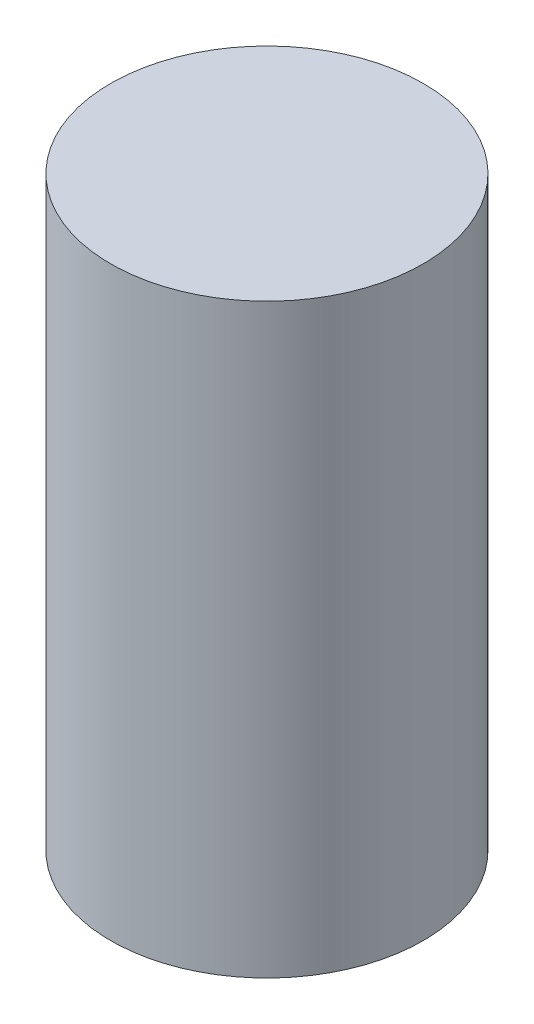
ISO-10303-21;
HEADER;
FILE_DESCRIPTION(('STEP AP214'),'2;1');
FILE_NAME('part.step','',(''),(''),'','','');
FILE_SCHEMA(('AUTOMOTIVE_DESIGN { 1 0 10303 214 1 1 1 1 }'));
ENDSEC;
DATA;
#1=APPLICATION_CONTEXT('core data for automotive mechanical design processes');
#2=APPLICATION_PROTOCOL_DEFINITION('international standard','automotive_design',2000,#1);
#3=PRODUCT_CONTEXT('',#1,'mechanical');
#4=PRODUCT('Part','Part','',(#3));
#5=PRODUCT_RELATED_PRODUCT_CATEGORY('part','',(#4));
#6=PRODUCT_DEFINITION_FORMATION('','',#4);
#7=PRODUCT_DEFINITION_CONTEXT('part definition',#1,'design');
#8=PRODUCT_DEFINITION('design','',#6,#7);
#9=PRODUCT_DEFINITION_SHAPE('','',#8);
#10=(LENGTH_UNIT() NAMED_UNIT(*) SI_UNIT(.MILLI.,.METRE.));
#11=(NAMED_UNIT(*) PLANE_ANGLE_UNIT() SI_UNIT($,.RADIAN.));
#12=(NAMED_UNIT(*) SI_UNIT($,.STERADIAN.) SOLID_ANGLE_UNIT());
#13=UNCERTAINTY_MEASURE_WITH_UNIT(LENGTH_MEASURE(1.E-05),#10,'distance_accuracy_value','');
#14=(GEOMETRIC_REPRESENTATION_CONTEXT(3) GLOBAL_UNCERTAINTY_ASSIGNED_CONTEXT((#13)) GLOBAL_UNIT_ASSIGNED_CONTEXT((#10,
#11,#12)) REPRESENTATION_CONTEXT('',''));
#15=CARTESIAN_POINT('',(0.,0.,0.));
#16=DIRECTION('',(0.,0.,1.));
#17=DIRECTION('',(1.,0.,0.));
#18=AXIS2_PLACEMENT_3D('',#15,#16,#17);
#19=CARTESIAN_POINT('',(0.,180.,0.));
#20=DIRECTION('',(0.,-1.,0.));
#21=DIRECTION('',(0.,0.,-1.));
#22=AXIS2_PLACEMENT_3D('',#19,#20,#21);
#23=CYLINDRICAL_SURFACE('',#22,48.);
#24=CARTESIAN_POINT('',(0.,180.,0.));
#25=DIRECTION('',(0.,1.,0.));
#26=DIRECTION('',(0.,0.,1.));
#27=AXIS2_PLACEMENT_3D('',#24,#25,#26);
#28=CIRCLE('',#27,48.);
#29=CARTESIAN_POINT('',(0.,180.,-48.));
#30=VERTEX_POINT('',#29);
#31=EDGE_CURVE('E10',#30,#30,#28,.T.);
#32=CARTESIAN_POINT('',(0.,0.,0.));
#33=DIRECTION('',(0.,1.,0.));
#34=DIRECTION('',(0.,0.,1.));
#35=AXIS2_PLACEMENT_3D('',#32,#33,#34);
#36=CIRCLE('',#35,48.);
#37=CARTESIAN_POINT('',(0.,0.,-48.));
#38=VERTEX_POINT('',#37);
#39=EDGE_CURVE('E35',#38,#38,#36,.T.);
#40=CARTESIAN_POINT('',(0.,180.,-48.));
#41=CARTESIAN_POINT('',(0.,178.125,-48.));
#42=CARTESIAN_POINT('',(0.,176.25,-48.));
#43=CARTESIAN_POINT('',(0.,172.5,-48.));
#44=CARTESIAN_POINT('',(0.,170.625,-48.));
#45=CARTESIAN_POINT('',(0.,166.875,-48.));
#46=CARTESIAN_POINT('',(0.,165.,-48.));
#47=CARTESIAN_POINT('',(0.,161.25,-48.));
#48=CARTESIAN_POINT('',(0.,159.375,-48.));
#49=CARTESIAN_POINT('',(0.,155.625,-48.));
#50=CARTESIAN_POINT('',(0.,153.75,-48.));
#51=CARTESIAN_POINT('',(0.,150.,-48.));
#52=CARTESIAN_POINT('',(0.,148.125,-48.));
#53=CARTESIAN_POINT('',(0.,144.375,-48.));
#54=CARTESIAN_POINT('',(0.,142.5,-48.));
#55=CARTESIAN_POINT('',(0.,138.75,-48.));
#56=CARTESIAN_POINT('',(0.,136.875,-48.));
#57=CARTESIAN_POINT('',(0.,133.125,-48.));
#58=CARTESIAN_POINT('',(0.,131.25,-48.));
#59=CARTESIAN_POINT('',(0.,127.5,-48.));
#60=CARTESIAN_POINT('',(0.,125.625,-48.));
#61=CARTESIAN_POINT('',(0.,121.875,-48.));
#62=CARTESIAN_POINT('',(0.,120.,-48.));
#63=CARTESIAN_POINT('',(0.,116.25,-48.));
#64=CARTESIAN_POINT('',(0.,114.375,-48.));
#65=CARTESIAN_POINT('',(0.,110.625,-48.));
#66=CARTESIAN_POINT('',(0.,108.75,-48.));
#67=CARTESIAN_POINT('',(0.,105.,-48.));
#68=CARTESIAN_POINT('',(0.,103.125,-48.));
#69=CARTESIAN_POINT('',(0.,99.375,-48.));
#70=CARTESIAN_POINT('',(0.,97.5,-48.));
#71=CARTESIAN_POINT('',(0.,93.75,-48.));
#72=CARTESIAN_POINT('',(0.,91.875,-48.));
#73=CARTESIAN_POINT('',(0.,88.125,-48.));
#74=CARTESIAN_POINT('',(0.,86.25,-48.));
#75=CARTESIAN_POINT('',(0.,82.5,-48.));
#76=CARTESIAN_POINT('',(0.,80.625,-48.));
#77=CARTESIAN_POINT('',(0.,76.875,-48.));
#78=CARTESIAN_POINT('',(0.,75.,-48.));
#79=CARTESIAN_POINT('',(0.,71.25,-48.));
#80=CARTESIAN_POINT('',(0.,69.375,-48.));
#81=CARTESIAN_POINT('',(0.,65.625,-48.));
#82=CARTESIAN_POINT('',(0.,63.75,-48.));
#83=CARTESIAN_POINT('',(0.,60.,-48.));
#84=CARTESIAN_POINT('',(0.,58.125,-48.));
#85=CARTESIAN_POINT('',(0.,54.375,-48.));
#86=CARTESIAN_POINT('',(0.,52.5,-48.));
#87=CARTESIAN_POINT('',(0.,48.75,-48.));
#88=CARTESIAN_POINT('',(0.,46.875,-48.));
#89=CARTESIAN_POINT('',(0.,43.125,-48.));
#90=CARTESIAN_POINT('',(0.,41.25,-48.));
#91=CARTESIAN_POINT('',(0.,37.5,-48.));
#92=CARTESIAN_POINT('',(0.,35.625,-48.));
#93=CARTESIAN_POINT('',(0.,31.875,-48.));
#94=CARTESIAN_POINT('',(0.,30.,-48.));
#95=CARTESIAN_POINT('',(0.,26.25,-48.));
#96=CARTESIAN_POINT('',(0.,24.375,-48.));
#97=CARTESIAN_POINT('',(0.,20.625,-48.));
#98=CARTESIAN_POINT('',(0.,18.75,-48.));
#99=CARTESIAN_POINT('',(0.,15.,-48.));
#100=CARTESIAN_POINT('',(0.,13.125,-48.));
#101=CARTESIAN_POINT('',(0.,9.37499999999998,-48.));
#102=CARTESIAN_POINT('',(0.,7.49999999999997,-48.));
#103=CARTESIAN_POINT('',(0.,3.74999999999997,-48.));
#104=CARTESIAN_POINT('',(0.,1.87499999999997,-48.));
#105=CARTESIAN_POINT('',(0.,0.,-48.));
#106=B_SPLINE_CURVE_WITH_KNOTS('',3,(#40,#41,#42,#43,#44,#45,#46,#47,#48,#49,#50,#51,#52,#53,
#54,#55,#56,#57,#58,#59,#60,#61,#62,#63,#64,#65,#66,#67,#68,#69,#70,#71,#72,#73,#74,#75,#76,#77,
#78,#79,#80,#81,#82,#83,#84,#85,#86,#87,#88,#89,#90,#91,#92,#93,#94,#95,#96,#97,#98,#99,#100,
#101,#102,#103,#104,#105),.UNSPECIFIED.,.F.,.F.,(4,2,2,2,2,2,2,2,2,2,2,2,2,2,2,2,2,2,2,2,2,2,2,
2,2,2,2,2,2,2,2,2,4),(0.,5.62499999999999,11.25,16.875,22.5,28.125,33.75,39.375,45.,50.625,
56.25,61.875,67.5,73.125,78.75,84.375,90.,95.625,101.25,106.875,112.5,118.125,123.75,129.375,
135.,140.625,146.25,151.875,157.5,163.125,168.75,174.375,180.),.UNSPECIFIED.);
#107=EDGE_CURVE('BSEAM32',#30,#38,#106,.T.);
#108=ORIENTED_EDGE('',*,*,#31,.F.);
#109=ORIENTED_EDGE('',*,*,#39,.T.);
#110=ORIENTED_EDGE('',*,*,#107,.T.);
#111=ORIENTED_EDGE('',*,*,#107,.F.);
#112=EDGE_LOOP('',(#108,#110,#109,#111));
#113=FACE_BOUND('',#112,.T.);
#114=ADVANCED_FACE('F32',(#113),#23,.T.);
#115=CARTESIAN_POINT('',(0.,180.,0.));
#116=DIRECTION('',(0.,1.,0.));
#117=DIRECTION('',(0.,0.,1.));
#118=AXIS2_PLACEMENT_3D('',#115,#116,#117);
#119=PLANE('',#118);
#120=ORIENTED_EDGE('',*,*,#31,.T.);
#121=EDGE_LOOP('',(#120));
#122=FACE_BOUND('',#121,.T.);
#123=ADVANCED_FACE('F47',(#122),#119,.T.);
#124=CARTESIAN_POINT('',(0.,0.,0.));
#125=DIRECTION('',(0.,1.,0.));
#126=DIRECTION('',(0.,0.,1.));
#127=AXIS2_PLACEMENT_3D('',#124,#125,#126);
#128=PLANE('',#127);
#129=ORIENTED_EDGE('',*,*,#39,.F.);
#130=EDGE_LOOP('',(#129));
#131=FACE_BOUND('',#130,.T.);
#132=ADVANCED_FACE('F45',(#131),#128,.F.);
#133=CLOSED_SHELL('',(#114,#123,#132));
#134=MANIFOLD_SOLID_BREP('B2',#133);
#135=ADVANCED_BREP_SHAPE_REPRESENTATION('',(#18,#134),#14);
#136=SHAPE_DEFINITION_REPRESENTATION(#9,#135);
ENDSEC;
END-ISO-10303-21;
